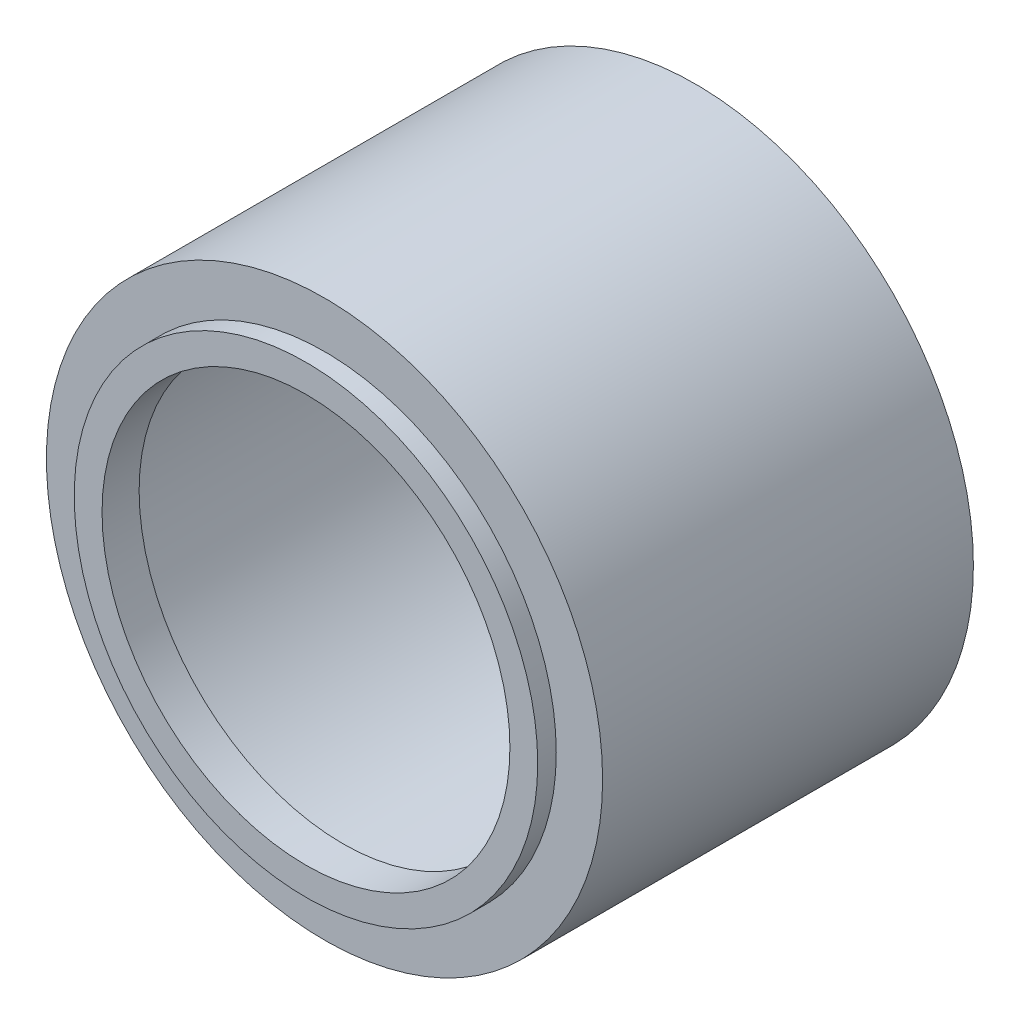
ISO-10303-21;
HEADER;
FILE_DESCRIPTION(('STEP AP214'),'2;1');
FILE_NAME('part.step','',(''),(''),'','','');
FILE_SCHEMA(('AUTOMOTIVE_DESIGN { 1 0 10303 214 1 1 1 1 }'));
ENDSEC;
DATA;
#1=APPLICATION_CONTEXT('core data for automotive mechanical design processes');
#2=APPLICATION_PROTOCOL_DEFINITION('international standard','automotive_design',2000,#1);
#3=PRODUCT_CONTEXT('',#1,'mechanical');
#4=PRODUCT('Part','Part','',(#3));
#5=PRODUCT_RELATED_PRODUCT_CATEGORY('part','',(#4));
#6=PRODUCT_DEFINITION_FORMATION('','',#4);
#7=PRODUCT_DEFINITION_CONTEXT('part definition',#1,'design');
#8=PRODUCT_DEFINITION('design','',#6,#7);
#9=PRODUCT_DEFINITION_SHAPE('','',#8);
#10=(LENGTH_UNIT() NAMED_UNIT(*) SI_UNIT(.MILLI.,.METRE.));
#11=(NAMED_UNIT(*) PLANE_ANGLE_UNIT() SI_UNIT($,.RADIAN.));
#12=(NAMED_UNIT(*) SI_UNIT($,.STERADIAN.) SOLID_ANGLE_UNIT());
#13=UNCERTAINTY_MEASURE_WITH_UNIT(LENGTH_MEASURE(1.E-05),#10,'distance_accuracy_value','');
#14=(GEOMETRIC_REPRESENTATION_CONTEXT(3) GLOBAL_UNCERTAINTY_ASSIGNED_CONTEXT((#13)) GLOBAL_UNIT_ASSIGNED_CONTEXT((#10,
#11,#12)) REPRESENTATION_CONTEXT('',''));
#15=CARTESIAN_POINT('',(0.,0.,0.));
#16=DIRECTION('',(0.,0.,1.));
#17=DIRECTION('',(1.,0.,0.));
#18=AXIS2_PLACEMENT_3D('',#15,#16,#17);
#19=CARTESIAN_POINT('',(0.,0.,20.));
#20=DIRECTION('',(0.,0.,-1.));
#21=DIRECTION('',(-1.,0.,0.));
#22=AXIS2_PLACEMENT_3D('',#19,#20,#21);
#23=CYLINDRICAL_SURFACE('',#22,15.);
#24=CARTESIAN_POINT('',(0.,0.,20.));
#25=DIRECTION('',(0.,0.,1.));
#26=DIRECTION('',(1.,0.,0.));
#27=AXIS2_PLACEMENT_3D('',#24,#25,#26);
#28=CIRCLE('',#27,15.);
#29=CARTESIAN_POINT('',(15.,0.,20.));
#30=VERTEX_POINT('',#29);
#31=EDGE_CURVE('E47',#30,#30,#28,.T.);
#32=ORIENTED_EDGE('',*,*,#31,.F.);
#33=EDGE_LOOP('',(#32));
#34=FACE_BOUND('',#33,.T.);
#35=CARTESIAN_POINT('',(0.,0.,0.));
#36=DIRECTION('',(0.,0.,1.));
#37=DIRECTION('',(1.,0.,0.));
#38=AXIS2_PLACEMENT_3D('',#35,#36,#37);
#39=CIRCLE('',#38,15.);
#40=CARTESIAN_POINT('',(15.,0.,0.));
#41=VERTEX_POINT('',#40);
#42=EDGE_CURVE('E42',#41,#41,#39,.T.);
#43=ORIENTED_EDGE('',*,*,#42,.T.);
#44=EDGE_LOOP('',(#43));
#45=FACE_BOUND('',#44,.T.);
#46=ADVANCED_FACE('F39',(#34,#45),#23,.T.);
#47=CARTESIAN_POINT('',(0.,0.,20.));
#48=DIRECTION('',(0.,0.,1.));
#49=DIRECTION('',(1.,0.,0.));
#50=AXIS2_PLACEMENT_3D('',#47,#48,#49);
#51=PLANE('',#50);
#52=CARTESIAN_POINT('',(0.,0.,20.));
#53=DIRECTION('',(0.,0.,1.));
#54=DIRECTION('',(1.,0.,0.));
#55=AXIS2_PLACEMENT_3D('',#52,#53,#54);
#56=CIRCLE('',#55,12.5);
#57=CARTESIAN_POINT('',(12.5,0.,20.));
#58=VERTEX_POINT('',#57);
#59=EDGE_CURVE('E10',#58,#58,#56,.T.);
#60=ORIENTED_EDGE('',*,*,#59,.F.);
#61=EDGE_LOOP('',(#60));
#62=FACE_BOUND('',#61,.T.);
#63=ORIENTED_EDGE('',*,*,#31,.T.);
#64=EDGE_LOOP('',(#63));
#65=FACE_BOUND('',#64,.T.);
#66=ADVANCED_FACE('F97',(#62,#65),#51,.T.);
#67=CARTESIAN_POINT('',(0.,0.,0.));
#68=DIRECTION('',(0.,0.,1.));
#69=DIRECTION('',(1.,0.,0.));
#70=AXIS2_PLACEMENT_3D('',#67,#68,#69);
#71=PLANE('',#70);
#72=CARTESIAN_POINT('',(0.,0.,0.));
#73=DIRECTION('',(0.,0.,-1.));
#74=DIRECTION('',(-1.,0.,0.));
#75=AXIS2_PLACEMENT_3D('',#72,#73,#74);
#76=CIRCLE('',#75,13.5);
#77=CARTESIAN_POINT('',(-13.5,0.,0.));
#78=VERTEX_POINT('',#77);
#79=EDGE_CURVE('E61',#78,#78,#76,.T.);
#80=ORIENTED_EDGE('',*,*,#79,.F.);
#81=EDGE_LOOP('',(#80));
#82=FACE_BOUND('',#81,.T.);
#83=ORIENTED_EDGE('',*,*,#42,.F.);
#84=EDGE_LOOP('',(#83));
#85=FACE_BOUND('',#84,.T.);
#86=ADVANCED_FACE('F102',(#82,#85),#71,.F.);
#87=CARTESIAN_POINT('',(0.,0.,19.));
#88=DIRECTION('',(0.,0.,-1.));
#89=DIRECTION('',(-1.,0.,0.));
#90=AXIS2_PLACEMENT_3D('',#87,#88,#89);
#91=CYLINDRICAL_SURFACE('',#90,13.5);
#92=CARTESIAN_POINT('',(0.,0.,19.));
#93=DIRECTION('',(0.,0.,-1.));
#94=DIRECTION('',(-1.,0.,0.));
#95=AXIS2_PLACEMENT_3D('',#92,#93,#94);
#96=CIRCLE('',#95,13.5);
#97=CARTESIAN_POINT('',(-13.5,0.,19.));
#98=VERTEX_POINT('',#97);
#99=EDGE_CURVE('E57',#98,#98,#96,.T.);
#100=ORIENTED_EDGE('',*,*,#99,.F.);
#101=EDGE_LOOP('',(#100));
#102=FACE_BOUND('',#101,.T.);
#103=ORIENTED_EDGE('',*,*,#79,.T.);
#104=EDGE_LOOP('',(#103));
#105=FACE_BOUND('',#104,.T.);
#106=ADVANCED_FACE('F112',(#102,#105),#91,.F.);
#107=CARTESIAN_POINT('',(0.,0.,19.));
#108=DIRECTION('',(0.,0.,-1.));
#109=DIRECTION('',(-1.,0.,0.));
#110=AXIS2_PLACEMENT_3D('',#107,#108,#109);
#111=PLANE('',#110);
#112=CARTESIAN_POINT('',(0.,0.,19.));
#113=DIRECTION('',(0.,0.,1.));
#114=DIRECTION('',(1.,0.,0.));
#115=AXIS2_PLACEMENT_3D('',#112,#113,#114);
#116=CIRCLE('',#115,11.);
#117=CARTESIAN_POINT('',(11.,0.,19.));
#118=VERTEX_POINT('',#117);
#119=EDGE_CURVE('E68',#118,#118,#116,.T.);
#120=ORIENTED_EDGE('',*,*,#119,.T.);
#121=EDGE_LOOP('',(#120));
#122=FACE_BOUND('',#121,.T.);
#123=ORIENTED_EDGE('',*,*,#99,.T.);
#124=EDGE_LOOP('',(#123));
#125=FACE_BOUND('',#124,.T.);
#126=ADVANCED_FACE('F93',(#122,#125),#111,.T.);
#127=CARTESIAN_POINT('',(0.,0.,21.));
#128=DIRECTION('',(0.,0.,-1.));
#129=DIRECTION('',(-1.,0.,0.));
#130=AXIS2_PLACEMENT_3D('',#127,#128,#129);
#131=CYLINDRICAL_SURFACE('',#130,12.5);
#132=CARTESIAN_POINT('',(0.,0.,21.));
#133=DIRECTION('',(0.,0.,1.));
#134=DIRECTION('',(1.,0.,0.));
#135=AXIS2_PLACEMENT_3D('',#132,#133,#134);
#136=CIRCLE('',#135,12.5);
#137=CARTESIAN_POINT('',(12.5,0.,21.));
#138=VERTEX_POINT('',#137);
#139=EDGE_CURVE('E55',#138,#138,#136,.T.);
#140=ORIENTED_EDGE('',*,*,#139,.F.);
#141=EDGE_LOOP('',(#140));
#142=FACE_BOUND('',#141,.T.);
#143=ORIENTED_EDGE('',*,*,#59,.T.);
#144=EDGE_LOOP('',(#143));
#145=FACE_BOUND('',#144,.T.);
#146=ADVANCED_FACE('F85',(#142,#145),#131,.T.);
#147=CARTESIAN_POINT('',(0.,0.,21.));
#148=DIRECTION('',(0.,0.,1.));
#149=DIRECTION('',(1.,0.,0.));
#150=AXIS2_PLACEMENT_3D('',#147,#148,#149);
#151=PLANE('',#150);
#152=CARTESIAN_POINT('',(0.,0.,21.));
#153=DIRECTION('',(0.,0.,1.));
#154=DIRECTION('',(1.,0.,0.));
#155=AXIS2_PLACEMENT_3D('',#152,#153,#154);
#156=CIRCLE('',#155,11.);
#157=CARTESIAN_POINT('',(11.,0.,21.));
#158=VERTEX_POINT('',#157);
#159=EDGE_CURVE('E73',#158,#158,#156,.T.);
#160=ORIENTED_EDGE('',*,*,#159,.F.);
#161=EDGE_LOOP('',(#160));
#162=FACE_BOUND('',#161,.T.);
#163=ORIENTED_EDGE('',*,*,#139,.T.);
#164=EDGE_LOOP('',(#163));
#165=FACE_BOUND('',#164,.T.);
#166=ADVANCED_FACE('F83',(#162,#165),#151,.T.);
#167=CARTESIAN_POINT('',(0.,0.,19.));
#168=DIRECTION('',(0.,0.,1.));
#169=DIRECTION('',(1.,0.,0.));
#170=AXIS2_PLACEMENT_3D('',#167,#168,#169);
#171=CYLINDRICAL_SURFACE('',#170,11.);
#172=ORIENTED_EDGE('',*,*,#119,.F.);
#173=EDGE_LOOP('',(#172));
#174=FACE_BOUND('',#173,.T.);
#175=ORIENTED_EDGE('',*,*,#159,.T.);
#176=EDGE_LOOP('',(#175));
#177=FACE_BOUND('',#176,.T.);
#178=ADVANCED_FACE('F81',(#174,#177),#171,.F.);
#179=CLOSED_SHELL('',(#46,#66,#86,#106,#126,#146,#166,#178));
#180=MANIFOLD_SOLID_BREP('B2',#179);
#181=ADVANCED_BREP_SHAPE_REPRESENTATION('',(#18,#180),#14);
#182=SHAPE_DEFINITION_REPRESENTATION(#9,#181);
ENDSEC;
END-ISO-10303-21;
